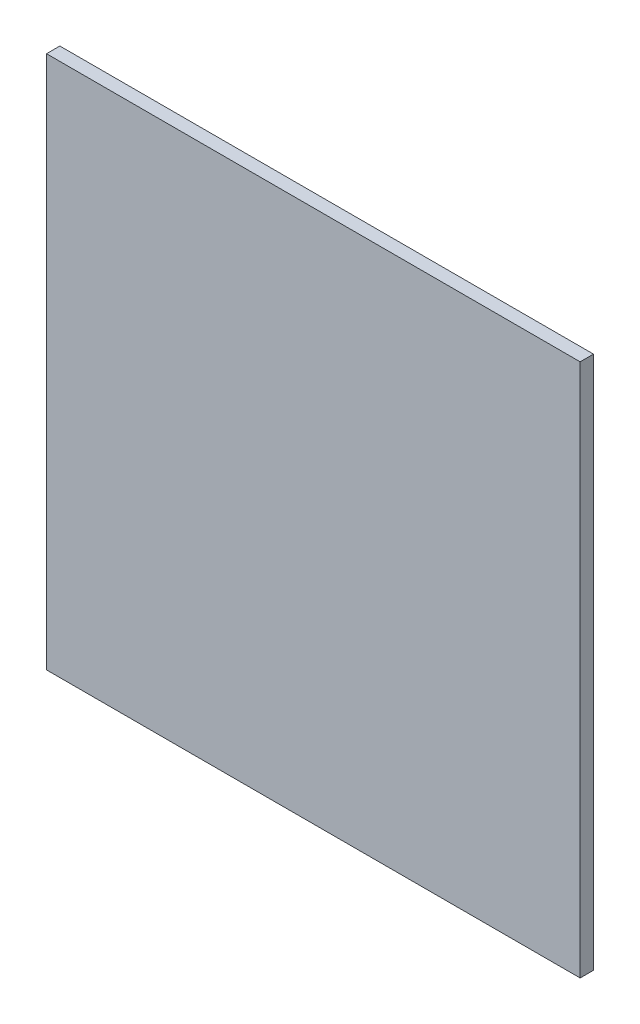
ISO-10303-21;
HEADER;
FILE_DESCRIPTION(('STEP AP214'),'2;1');
FILE_NAME('part.step','',(''),(''),'','','');
FILE_SCHEMA(('AUTOMOTIVE_DESIGN { 1 0 10303 214 1 1 1 1 }'));
ENDSEC;
DATA;
#1=APPLICATION_CONTEXT('core data for automotive mechanical design processes');
#2=APPLICATION_PROTOCOL_DEFINITION('international standard','automotive_design',2000,#1);
#3=PRODUCT_CONTEXT('',#1,'mechanical');
#4=PRODUCT('Part','Part','',(#3));
#5=PRODUCT_RELATED_PRODUCT_CATEGORY('part','',(#4));
#6=PRODUCT_DEFINITION_FORMATION('','',#4);
#7=PRODUCT_DEFINITION_CONTEXT('part definition',#1,'design');
#8=PRODUCT_DEFINITION('design','',#6,#7);
#9=PRODUCT_DEFINITION_SHAPE('','',#8);
#10=(LENGTH_UNIT() NAMED_UNIT(*) SI_UNIT(.MILLI.,.METRE.));
#11=(NAMED_UNIT(*) PLANE_ANGLE_UNIT() SI_UNIT($,.RADIAN.));
#12=(NAMED_UNIT(*) SI_UNIT($,.STERADIAN.) SOLID_ANGLE_UNIT());
#13=UNCERTAINTY_MEASURE_WITH_UNIT(LENGTH_MEASURE(1.E-05),#10,'distance_accuracy_value','');
#14=(GEOMETRIC_REPRESENTATION_CONTEXT(3) GLOBAL_UNCERTAINTY_ASSIGNED_CONTEXT((#13)) GLOBAL_UNIT_ASSIGNED_CONTEXT((#10,
#11,#12)) REPRESENTATION_CONTEXT('',''));
#15=CARTESIAN_POINT('',(0.,0.,0.));
#16=DIRECTION('',(0.,0.,1.));
#17=DIRECTION('',(1.,0.,0.));
#18=AXIS2_PLACEMENT_3D('',#15,#16,#17);
#19=CARTESIAN_POINT('',(0.,0.,10.));
#20=DIRECTION('',(-1.,0.,0.));
#21=DIRECTION('',(0.,0.,1.));
#22=AXIS2_PLACEMENT_3D('',#19,#20,#21);
#23=PLANE('',#22);
#24=DIRECTION('',(0.,1.,0.));
#25=VECTOR('',#24,1.);
#26=CARTESIAN_POINT('',(0.,0.,0.));
#27=LINE('',#26,#25);
#28=CARTESIAN_POINT('',(0.,0.,0.));
#29=VERTEX_POINT('',#28);
#30=CARTESIAN_POINT('',(0.,400.,0.));
#31=VERTEX_POINT('',#30);
#32=EDGE_CURVE('E98',#29,#31,#27,.T.);
#33=ORIENTED_EDGE('',*,*,#32,.F.);
#34=DIRECTION('',(0.,0.,-1.));
#35=VECTOR('',#34,1.);
#36=CARTESIAN_POINT('',(0.,0.,10.));
#37=LINE('',#36,#35);
#38=CARTESIAN_POINT('',(0.,0.,10.));
#39=VERTEX_POINT('',#38);
#40=EDGE_CURVE('E11',#39,#29,#37,.T.);
#41=ORIENTED_EDGE('',*,*,#40,.F.);
#42=DIRECTION('',(0.,1.,0.));
#43=VECTOR('',#42,1.);
#44=CARTESIAN_POINT('',(0.,0.,10.));
#45=LINE('',#44,#43);
#46=CARTESIAN_POINT('',(0.,400.,10.));
#47=VERTEX_POINT('',#46);
#48=EDGE_CURVE('E93',#39,#47,#45,.T.);
#49=ORIENTED_EDGE('',*,*,#48,.T.);
#50=DIRECTION('',(0.,0.,-1.));
#51=VECTOR('',#50,1.);
#52=CARTESIAN_POINT('',(0.,400.,10.));
#53=LINE('',#52,#51);
#54=EDGE_CURVE('E36',#47,#31,#53,.T.);
#55=ORIENTED_EDGE('',*,*,#54,.T.);
#56=EDGE_LOOP('',(#33,#41,#49,#55));
#57=FACE_BOUND('',#56,.T.);
#58=ADVANCED_FACE('F33',(#57),#23,.T.);
#59=CARTESIAN_POINT('',(0.,0.,10.));
#60=DIRECTION('',(0.,1.,0.));
#61=DIRECTION('',(0.,0.,1.));
#62=AXIS2_PLACEMENT_3D('',#59,#60,#61);
#63=PLANE('',#62);
#64=DIRECTION('',(1.,0.,0.));
#65=VECTOR('',#64,1.);
#66=CARTESIAN_POINT('',(0.,0.,0.));
#67=LINE('',#66,#65);
#68=CARTESIAN_POINT('',(400.,0.,0.));
#69=VERTEX_POINT('',#68);
#70=EDGE_CURVE('E66',#29,#69,#67,.T.);
#71=ORIENTED_EDGE('',*,*,#70,.T.);
#72=DIRECTION('',(0.,0.,-1.));
#73=VECTOR('',#72,1.);
#74=CARTESIAN_POINT('',(400.,0.,10.));
#75=LINE('',#74,#73);
#76=CARTESIAN_POINT('',(400.,0.,10.));
#77=VERTEX_POINT('',#76);
#78=EDGE_CURVE('E42',#77,#69,#75,.T.);
#79=ORIENTED_EDGE('',*,*,#78,.F.);
#80=DIRECTION('',(1.,0.,0.));
#81=VECTOR('',#80,1.);
#82=CARTESIAN_POINT('',(0.,0.,10.));
#83=LINE('',#82,#81);
#84=EDGE_CURVE('E83',#39,#77,#83,.T.);
#85=ORIENTED_EDGE('',*,*,#84,.F.);
#86=ORIENTED_EDGE('',*,*,#40,.T.);
#87=EDGE_LOOP('',(#71,#79,#85,#86));
#88=FACE_BOUND('',#87,.T.);
#89=ADVANCED_FACE('F108',(#88),#63,.F.);
#90=CARTESIAN_POINT('',(400.,0.,10.));
#91=DIRECTION('',(-1.,0.,0.));
#92=DIRECTION('',(0.,0.,1.));
#93=AXIS2_PLACEMENT_3D('',#90,#91,#92);
#94=PLANE('',#93);
#95=DIRECTION('',(0.,1.,0.));
#96=VECTOR('',#95,1.);
#97=CARTESIAN_POINT('',(400.,0.,0.));
#98=LINE('',#97,#96);
#99=CARTESIAN_POINT('',(400.,400.,0.));
#100=VERTEX_POINT('',#99);
#101=EDGE_CURVE('E90',#69,#100,#98,.T.);
#102=ORIENTED_EDGE('',*,*,#101,.T.);
#103=DIRECTION('',(0.,0.,-1.));
#104=VECTOR('',#103,1.);
#105=CARTESIAN_POINT('',(400.,400.,10.));
#106=LINE('',#105,#104);
#107=CARTESIAN_POINT('',(400.,400.,10.));
#108=VERTEX_POINT('',#107);
#109=EDGE_CURVE('E87',#108,#100,#106,.T.);
#110=ORIENTED_EDGE('',*,*,#109,.F.);
#111=DIRECTION('',(0.,1.,0.));
#112=VECTOR('',#111,1.);
#113=CARTESIAN_POINT('',(400.,0.,10.));
#114=LINE('',#113,#112);
#115=EDGE_CURVE('E78',#77,#108,#114,.T.);
#116=ORIENTED_EDGE('',*,*,#115,.F.);
#117=ORIENTED_EDGE('',*,*,#78,.T.);
#118=EDGE_LOOP('',(#102,#110,#116,#117));
#119=FACE_BOUND('',#118,.T.);
#120=ADVANCED_FACE('F88',(#119),#94,.F.);
#121=CARTESIAN_POINT('',(0.,400.,10.));
#122=DIRECTION('',(0.,1.,0.));
#123=DIRECTION('',(0.,0.,1.));
#124=AXIS2_PLACEMENT_3D('',#121,#122,#123);
#125=PLANE('',#124);
#126=DIRECTION('',(1.,0.,0.));
#127=VECTOR('',#126,1.);
#128=CARTESIAN_POINT('',(0.,400.,0.));
#129=LINE('',#128,#127);
#130=EDGE_CURVE('E101',#31,#100,#129,.T.);
#131=ORIENTED_EDGE('',*,*,#130,.F.);
#132=ORIENTED_EDGE('',*,*,#54,.F.);
#133=DIRECTION('',(1.,0.,0.));
#134=VECTOR('',#133,1.);
#135=CARTESIAN_POINT('',(0.,400.,10.));
#136=LINE('',#135,#134);
#137=EDGE_CURVE('E82',#47,#108,#136,.T.);
#138=ORIENTED_EDGE('',*,*,#137,.T.);
#139=ORIENTED_EDGE('',*,*,#109,.T.);
#140=EDGE_LOOP('',(#131,#132,#138,#139));
#141=FACE_BOUND('',#140,.T.);
#142=ADVANCED_FACE('F92',(#141),#125,.T.);
#143=CARTESIAN_POINT('',(0.,0.,10.));
#144=DIRECTION('',(0.,0.,-1.));
#145=DIRECTION('',(-1.,0.,0.));
#146=AXIS2_PLACEMENT_3D('',#143,#144,#145);
#147=PLANE('',#146);
#148=ORIENTED_EDGE('',*,*,#48,.F.);
#149=ORIENTED_EDGE('',*,*,#84,.T.);
#150=ORIENTED_EDGE('',*,*,#115,.T.);
#151=ORIENTED_EDGE('',*,*,#137,.F.);
#152=EDGE_LOOP('',(#148,#149,#150,#151));
#153=FACE_BOUND('',#152,.T.);
#154=ADVANCED_FACE('F81',(#153),#147,.F.);
#155=CARTESIAN_POINT('',(0.,0.,0.));
#156=DIRECTION('',(0.,0.,-1.));
#157=DIRECTION('',(-1.,0.,0.));
#158=AXIS2_PLACEMENT_3D('',#155,#156,#157);
#159=PLANE('',#158);
#160=ORIENTED_EDGE('',*,*,#32,.T.);
#161=ORIENTED_EDGE('',*,*,#130,.T.);
#162=ORIENTED_EDGE('',*,*,#101,.F.);
#163=ORIENTED_EDGE('',*,*,#70,.F.);
#164=EDGE_LOOP('',(#160,#161,#162,#163));
#165=FACE_BOUND('',#164,.T.);
#166=ADVANCED_FACE('F106',(#165),#159,.T.);
#167=CLOSED_SHELL('',(#58,#89,#120,#142,#154,#166));
#168=MANIFOLD_SOLID_BREP('B2',#167);
#169=ADVANCED_BREP_SHAPE_REPRESENTATION('',(#18,#168),#14);
#170=SHAPE_DEFINITION_REPRESENTATION(#9,#169);
ENDSEC;
END-ISO-10303-21;
